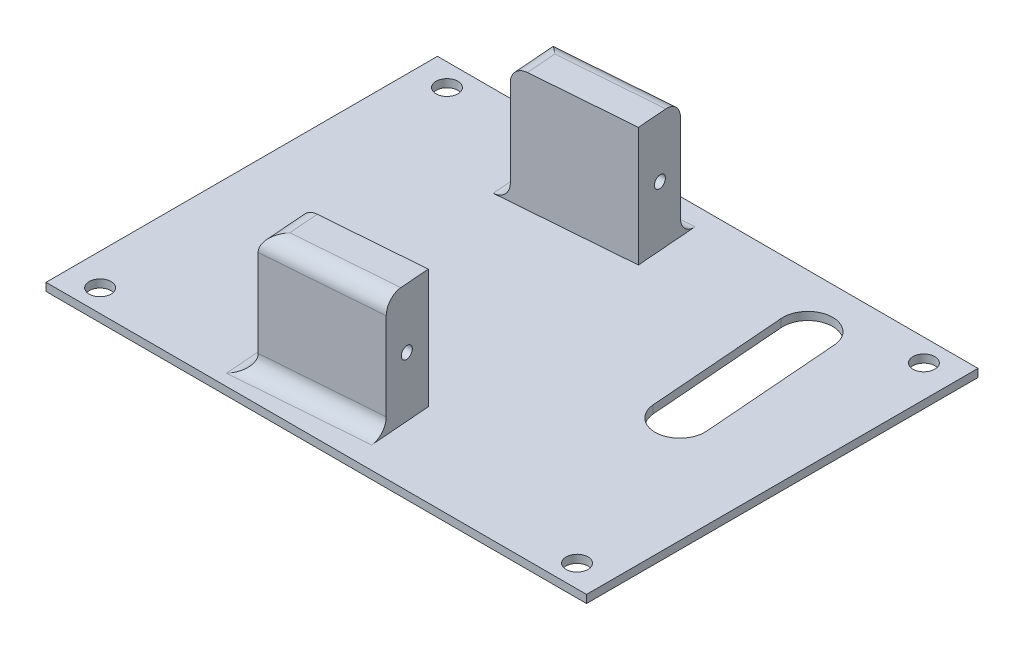
ISO-10303-21;
HEADER;
FILE_DESCRIPTION(('STEP AP214'),'2;1');
FILE_NAME('part.step','',(''),(''),'','','');
FILE_SCHEMA(('AUTOMOTIVE_DESIGN { 1 0 10303 214 1 1 1 1 }'));
ENDSEC;
DATA;
#1=APPLICATION_CONTEXT('core data for automotive mechanical design processes');
#2=APPLICATION_PROTOCOL_DEFINITION('international standard','automotive_design',2000,#1);
#3=PRODUCT_CONTEXT('',#1,'mechanical');
#4=PRODUCT('Part','Part','',(#3));
#5=PRODUCT_RELATED_PRODUCT_CATEGORY('part','',(#4));
#6=PRODUCT_DEFINITION_FORMATION('','',#4);
#7=PRODUCT_DEFINITION_CONTEXT('part definition',#1,'design');
#8=PRODUCT_DEFINITION('design','',#6,#7);
#9=PRODUCT_DEFINITION_SHAPE('','',#8);
#10=(LENGTH_UNIT() NAMED_UNIT(*) SI_UNIT(.MILLI.,.METRE.));
#11=(NAMED_UNIT(*) PLANE_ANGLE_UNIT() SI_UNIT($,.RADIAN.));
#12=(NAMED_UNIT(*) SI_UNIT($,.STERADIAN.) SOLID_ANGLE_UNIT());
#13=UNCERTAINTY_MEASURE_WITH_UNIT(LENGTH_MEASURE(1.E-05),#10,'distance_accuracy_value','');
#14=(GEOMETRIC_REPRESENTATION_CONTEXT(3) GLOBAL_UNCERTAINTY_ASSIGNED_CONTEXT((#13)) GLOBAL_UNIT_ASSIGNED_CONTEXT((#10,
#11,#12)) REPRESENTATION_CONTEXT('',''));
#15=CARTESIAN_POINT('',(0.,0.,0.));
#16=DIRECTION('',(0.,0.,1.));
#17=DIRECTION('',(1.,0.,0.));
#18=AXIS2_PLACEMENT_3D('',#15,#16,#17);
#19=CARTESIAN_POINT('',(0.,0.8,0.));
#20=DIRECTION('',(1.,0.,0.));
#21=DIRECTION('',(0.,0.,1.));
#22=AXIS2_PLACEMENT_3D('',#19,#20,#21);
#23=PLANE('',#22);
#24=DIRECTION('',(0.,0.,-1.));
#25=VECTOR('',#24,1.);
#26=CARTESIAN_POINT('',(0.,0.,0.));
#27=LINE('',#26,#25);
#28=CARTESIAN_POINT('',(0.,0.,39.4));
#29=VERTEX_POINT('',#28);
#30=CARTESIAN_POINT('',(0.,0.,0.));
#31=VERTEX_POINT('',#30);
#32=EDGE_CURVE('E308',#29,#31,#27,.T.);
#33=ORIENTED_EDGE('',*,*,#32,.F.);
#34=DIRECTION('',(0.,-1.,0.));
#35=VECTOR('',#34,1.);
#36=CARTESIAN_POINT('',(0.,0.8,39.4));
#37=LINE('',#36,#35);
#38=CARTESIAN_POINT('',(0.,0.8,39.4));
#39=VERTEX_POINT('',#38);
#40=EDGE_CURVE('E323',#39,#29,#37,.T.);
#41=ORIENTED_EDGE('',*,*,#40,.F.);
#42=DIRECTION('',(0.,0.,-1.));
#43=VECTOR('',#42,1.);
#44=CARTESIAN_POINT('',(0.,0.8,0.));
#45=LINE('',#44,#43);
#46=CARTESIAN_POINT('',(0.,0.8,0.));
#47=VERTEX_POINT('',#46);
#48=EDGE_CURVE('E311',#39,#47,#45,.T.);
#49=ORIENTED_EDGE('',*,*,#48,.T.);
#50=DIRECTION('',(0.,-1.,0.));
#51=VECTOR('',#50,1.);
#52=CARTESIAN_POINT('',(0.,0.8,0.));
#53=LINE('',#52,#51);
#54=EDGE_CURVE('E341',#47,#31,#53,.T.);
#55=ORIENTED_EDGE('',*,*,#54,.T.);
#56=EDGE_LOOP('',(#33,#41,#49,#55));
#57=FACE_BOUND('',#56,.T.);
#58=ADVANCED_FACE('F45',(#57),#23,.F.);
#59=CARTESIAN_POINT('',(0.,0.8,0.));
#60=DIRECTION('',(0.,0.,1.));
#61=DIRECTION('',(-1.,0.,0.));
#62=AXIS2_PLACEMENT_3D('',#59,#60,#61);
#63=PLANE('',#62);
#64=DIRECTION('',(1.,0.,0.));
#65=VECTOR('',#64,1.);
#66=CARTESIAN_POINT('',(0.,0.,0.));
#67=LINE('',#66,#65);
#68=CARTESIAN_POINT('',(54.4,0.,0.));
#69=VERTEX_POINT('',#68);
#70=EDGE_CURVE('E326',#31,#69,#67,.T.);
#71=ORIENTED_EDGE('',*,*,#70,.F.);
#72=ORIENTED_EDGE('',*,*,#54,.F.);
#73=DIRECTION('',(1.,0.,0.));
#74=VECTOR('',#73,1.);
#75=CARTESIAN_POINT('',(0.,0.8,0.));
#76=LINE('',#75,#74);
#77=CARTESIAN_POINT('',(54.4,0.8,0.));
#78=VERTEX_POINT('',#77);
#79=EDGE_CURVE('E314',#47,#78,#76,.T.);
#80=ORIENTED_EDGE('',*,*,#79,.T.);
#81=DIRECTION('',(0.,-1.,0.));
#82=VECTOR('',#81,1.);
#83=CARTESIAN_POINT('',(54.4,0.8,0.));
#84=LINE('',#83,#82);
#85=EDGE_CURVE('E338',#78,#69,#84,.T.);
#86=ORIENTED_EDGE('',*,*,#85,.T.);
#87=EDGE_LOOP('',(#71,#72,#80,#86));
#88=FACE_BOUND('',#87,.T.);
#89=ADVANCED_FACE('F465',(#88),#63,.F.);
#90=CARTESIAN_POINT('',(54.4,0.8,0.));
#91=DIRECTION('',(-1.,0.,0.));
#92=DIRECTION('',(0.,0.,-1.));
#93=AXIS2_PLACEMENT_3D('',#90,#91,#92);
#94=PLANE('',#93);
#95=DIRECTION('',(0.,0.,1.));
#96=VECTOR('',#95,1.);
#97=CARTESIAN_POINT('',(54.4,0.,0.));
#98=LINE('',#97,#96);
#99=CARTESIAN_POINT('',(54.4,0.,39.4));
#100=VERTEX_POINT('',#99);
#101=EDGE_CURVE('E329',#69,#100,#98,.T.);
#102=ORIENTED_EDGE('',*,*,#101,.F.);
#103=ORIENTED_EDGE('',*,*,#85,.F.);
#104=DIRECTION('',(0.,0.,1.));
#105=VECTOR('',#104,1.);
#106=CARTESIAN_POINT('',(54.4,0.8,0.));
#107=LINE('',#106,#105);
#108=CARTESIAN_POINT('',(54.4,0.8,39.4));
#109=VERTEX_POINT('',#108);
#110=EDGE_CURVE('E318',#78,#109,#107,.T.);
#111=ORIENTED_EDGE('',*,*,#110,.T.);
#112=DIRECTION('',(0.,-1.,0.));
#113=VECTOR('',#112,1.);
#114=CARTESIAN_POINT('',(54.4,0.8,39.4));
#115=LINE('',#114,#113);
#116=EDGE_CURVE('E335',#109,#100,#115,.T.);
#117=ORIENTED_EDGE('',*,*,#116,.T.);
#118=EDGE_LOOP('',(#102,#103,#111,#117));
#119=FACE_BOUND('',#118,.T.);
#120=ADVANCED_FACE('F463',(#119),#94,.F.);
#121=CARTESIAN_POINT('',(0.,0.8,39.4));
#122=DIRECTION('',(0.,0.,-1.));
#123=DIRECTION('',(1.,0.,0.));
#124=AXIS2_PLACEMENT_3D('',#121,#122,#123);
#125=PLANE('',#124);
#126=DIRECTION('',(-1.,0.,0.));
#127=VECTOR('',#126,1.);
#128=CARTESIAN_POINT('',(0.,0.,39.4));
#129=LINE('',#128,#127);
#130=EDGE_CURVE('E315',#100,#29,#129,.T.);
#131=ORIENTED_EDGE('',*,*,#130,.F.);
#132=ORIENTED_EDGE('',*,*,#116,.F.);
#133=DIRECTION('',(-1.,0.,0.));
#134=VECTOR('',#133,1.);
#135=CARTESIAN_POINT('',(0.,0.8,39.4));
#136=LINE('',#135,#134);
#137=EDGE_CURVE('E321',#109,#39,#136,.T.);
#138=ORIENTED_EDGE('',*,*,#137,.T.);
#139=ORIENTED_EDGE('',*,*,#40,.T.);
#140=EDGE_LOOP('',(#131,#132,#138,#139));
#141=FACE_BOUND('',#140,.T.);
#142=ADVANCED_FACE('F443',(#141),#125,.F.);
#143=CARTESIAN_POINT('',(0.,0.8,0.));
#144=DIRECTION('',(0.,-1.,0.));
#145=DIRECTION('',(0.,0.,1.));
#146=AXIS2_PLACEMENT_3D('',#143,#144,#145);
#147=PLANE('',#146);
#148=CARTESIAN_POINT('',(42.6363450689998,0.8,5.36196488668117));
#149=DIRECTION('',(0.,-1.,0.));
#150=DIRECTION('',(0.,0.,-1.));
#151=AXIS2_PLACEMENT_3D('',#148,#149,#150);
#152=CIRCLE('',#151,2.5);
#153=CARTESIAN_POINT('',(40.1438476958249,0.8,5.55550259545118));
#154=VERTEX_POINT('',#153);
#155=CARTESIAN_POINT('',(45.1288424421748,0.8,5.16842717791116));
#156=VERTEX_POINT('',#155);
#157=EDGE_CURVE('E203',#154,#156,#152,.T.);
#158=ORIENTED_EDGE('',*,*,#157,.T.);
#159=DIRECTION('',(-0.0774150835080043,0.,-0.996998949269982));
#160=VECTOR('',#159,1.);
#161=CARTESIAN_POINT('',(44.4594675366978,0.8,-3.45219360019891));
#162=LINE('',#161,#160);
#163=CARTESIAN_POINT('',(46.2126536112869,0.8,19.1264124676909));
#164=VERTEX_POINT('',#163);
#165=EDGE_CURVE('E226',#164,#156,#162,.T.);
#166=ORIENTED_EDGE('',*,*,#165,.F.);
#167=CARTESIAN_POINT('',(43.7201562381119,0.8,19.3199501764609));
#168=DIRECTION('',(0.,-1.,0.));
#169=DIRECTION('',(0.,0.,-1.));
#170=AXIS2_PLACEMENT_3D('',#167,#168,#169);
#171=CIRCLE('',#170,2.5);
#172=CARTESIAN_POINT('',(41.227658864937,0.8,19.5134878852309));
#173=VERTEX_POINT('',#172);
#174=EDGE_CURVE('E223',#164,#173,#171,.T.);
#175=ORIENTED_EDGE('',*,*,#174,.T.);
#176=DIRECTION('',(-0.0774150835080043,0.,-0.996998949269982));
#177=VECTOR('',#176,1.);
#178=CARTESIAN_POINT('',(39.4744727903479,0.8,-3.06511818265889));
#179=LINE('',#178,#177);
#180=EDGE_CURVE('E234',#173,#154,#179,.T.);
#181=ORIENTED_EDGE('',*,*,#180,.T.);
#182=EDGE_LOOP('',(#158,#166,#175,#181));
#183=FACE_BOUND('',#182,.T.);
#184=DIRECTION('',(0.996998949269982,0.,-0.0774150835080046));
#185=VECTOR('',#184,1.);
#186=CARTESIAN_POINT('',(3.05375947752351,0.8,39.3281884156255));
#187=LINE('',#186,#185);
#188=CARTESIAN_POINT('',(17.0050591665599,0.8,38.2448963707715));
#189=VERTEX_POINT('',#188);
#190=CARTESIAN_POINT('',(30.5642448766316,0.8,37.1920512350627));
#191=VERTEX_POINT('',#190);
#192=EDGE_CURVE('E394',#189,#191,#187,.T.);
#193=ORIENTED_EDGE('',*,*,#192,.F.);
#194=DIRECTION('',(-0.0774150835080041,0.,-0.996998949269982));
#195=VECTOR('',#194,1.);
#196=CARTESIAN_POINT('',(16.8811950329471,0.8,36.6496980519396));
#197=LINE('',#196,#195);
#198=CARTESIAN_POINT('',(16.5250856488103,0.8,32.0635028852977));
#199=VERTEX_POINT('',#198);
#200=EDGE_CURVE('E392',#199,#189,#197,.F.);
#201=ORIENTED_EDGE('',*,*,#200,.F.);
#202=DIRECTION('',(0.996998949269982,0.,-0.0774150835080049));
#203=VECTOR('',#202,1.);
#204=CARTESIAN_POINT('',(2.57378595977389,0.8,33.1467949301516));
#205=LINE('',#204,#203);
#206=CARTESIAN_POINT('',(30.084271358882,0.8,31.0106577495888));
#207=VERTEX_POINT('',#206);
#208=EDGE_CURVE('E241',#199,#207,#205,.T.);
#209=ORIENTED_EDGE('',*,*,#208,.T.);
#210=DIRECTION('',(-0.077415083508005,0.,-0.996998949269982));
#211=VECTOR('',#210,1.);
#212=CARTESIAN_POINT('',(27.5104853991081,0.8,-2.13613718056285));
#213=LINE('',#212,#211);
#214=EDGE_CURVE('E249',#191,#207,#213,.T.);
#215=ORIENTED_EDGE('',*,*,#214,.F.);
#216=EDGE_LOOP('',(#193,#201,#209,#215));
#217=FACE_BOUND('',#216,.T.);
#218=DIRECTION('',(-0.0774150835080049,0.,-0.996998949269982));
#219=VECTOR('',#218,1.);
#220=CARTESIAN_POINT('',(14.7445387281261,0.8,9.13252705208806));
#221=LINE('',#220,#219);
#222=CARTESIAN_POINT('',(14.2645652103765,0.8,2.95113356661417));
#223=VERTEX_POINT('',#222);
#224=CARTESIAN_POINT('',(14.7445387281261,0.8,9.13252705208806));
#225=VERTEX_POINT('',#224);
#226=EDGE_CURVE('E389',#223,#225,#221,.F.);
#227=ORIENTED_EDGE('',*,*,#226,.F.);
#228=DIRECTION('',(0.996998949269982,0.,-0.0774150835080045));
#229=VECTOR('',#228,1.);
#230=CARTESIAN_POINT('',(15.8597635292085,0.8,2.82726943300136));
#231=LINE('',#230,#229);
#232=CARTESIAN_POINT('',(27.8237509204483,0.8,1.89828843090531));
#233=VERTEX_POINT('',#232);
#234=EDGE_CURVE('E386',#233,#223,#231,.F.);
#235=ORIENTED_EDGE('',*,*,#234,.F.);
#236=DIRECTION('',(0.0774150835080042,0.,0.996998949269982));
#237=VECTOR('',#236,1.);
#238=CARTESIAN_POINT('',(27.5104853991081,0.8,-2.13613718056283));
#239=LINE('',#238,#237);
#240=CARTESIAN_POINT('',(28.3037244381979,0.8,8.0796819163792));
#241=VERTEX_POINT('',#240);
#242=EDGE_CURVE('E269',#233,#241,#239,.T.);
#243=ORIENTED_EDGE('',*,*,#242,.T.);
#244=DIRECTION('',(0.996998949269982,0.,-0.0774150835080043));
#245=VECTOR('',#244,1.);
#246=CARTESIAN_POINT('',(0.793239039089771,0.8,10.215819096942));
#247=LINE('',#246,#245);
#248=EDGE_CURVE('E264',#225,#241,#247,.T.);
#249=ORIENTED_EDGE('',*,*,#248,.F.);
#250=EDGE_LOOP('',(#227,#235,#243,#249));
#251=FACE_BOUND('',#250,.T.);
#252=CARTESIAN_POINT('',(3.2,0.8,37.155));
#253=DIRECTION('',(0.,-1.,0.));
#254=DIRECTION('',(0.,0.,-1.));
#255=AXIS2_PLACEMENT_3D('',#252,#253,#254);
#256=CIRCLE('',#255,1.1);
#257=CARTESIAN_POINT('',(3.2,0.8,36.055));
#258=VERTEX_POINT('',#257);
#259=EDGE_CURVE('E300',#258,#258,#256,.T.);
#260=ORIENTED_EDGE('',*,*,#259,.T.);
#261=EDGE_LOOP('',(#260));
#262=FACE_BOUND('',#261,.T.);
#263=CARTESIAN_POINT('',(51.2,0.8,2.24500000000001));
#264=DIRECTION('',(0.,-1.,0.));
#265=DIRECTION('',(0.,0.,-1.));
#266=AXIS2_PLACEMENT_3D('',#263,#264,#265);
#267=CIRCLE('',#266,1.1);
#268=CARTESIAN_POINT('',(51.2,0.8,1.14500000000001));
#269=VERTEX_POINT('',#268);
#270=EDGE_CURVE('E294',#269,#269,#267,.T.);
#271=ORIENTED_EDGE('',*,*,#270,.T.);
#272=EDGE_LOOP('',(#271));
#273=FACE_BOUND('',#272,.T.);
#274=CARTESIAN_POINT('',(3.2,0.8,2.245));
#275=DIRECTION('',(0.,-1.,0.));
#276=DIRECTION('',(0.,0.,-1.));
#277=AXIS2_PLACEMENT_3D('',#274,#275,#276);
#278=CIRCLE('',#277,1.1);
#279=CARTESIAN_POINT('',(3.2,0.8,1.145));
#280=VERTEX_POINT('',#279);
#281=EDGE_CURVE('E287',#280,#280,#278,.T.);
#282=ORIENTED_EDGE('',*,*,#281,.T.);
#283=EDGE_LOOP('',(#282));
#284=FACE_BOUND('',#283,.T.);
#285=CARTESIAN_POINT('',(51.2,0.8,37.155));
#286=DIRECTION('',(0.,-1.,0.));
#287=DIRECTION('',(0.,0.,-1.));
#288=AXIS2_PLACEMENT_3D('',#285,#286,#287);
#289=CIRCLE('',#288,1.1);
#290=CARTESIAN_POINT('',(51.2,0.8,36.055));
#291=VERTEX_POINT('',#290);
#292=EDGE_CURVE('E290',#291,#291,#289,.T.);
#293=ORIENTED_EDGE('',*,*,#292,.T.);
#294=EDGE_LOOP('',(#293));
#295=FACE_BOUND('',#294,.T.);
#296=ORIENTED_EDGE('',*,*,#48,.F.);
#297=ORIENTED_EDGE('',*,*,#137,.F.);
#298=ORIENTED_EDGE('',*,*,#110,.F.);
#299=ORIENTED_EDGE('',*,*,#79,.F.);
#300=EDGE_LOOP('',(#296,#297,#298,#299));
#301=FACE_BOUND('',#300,.T.);
#302=ADVANCED_FACE('F440',(#183,#217,#251,#262,#273,#284,#295,#301),#147,.F.);
#303=CARTESIAN_POINT('',(0.,0.,0.));
#304=DIRECTION('',(0.,-1.,0.));
#305=DIRECTION('',(0.,0.,1.));
#306=AXIS2_PLACEMENT_3D('',#303,#304,#305);
#307=PLANE('',#306);
#308=DIRECTION('',(-0.0774150835080043,0.,-0.996998949269982));
#309=VECTOR('',#308,1.);
#310=CARTESIAN_POINT('',(39.4744727903479,0.,-3.06511818265889));
#311=LINE('',#310,#309);
#312=CARTESIAN_POINT('',(41.227658864937,0.,19.5134878852309));
#313=VERTEX_POINT('',#312);
#314=CARTESIAN_POINT('',(40.1438476958249,0.,5.55550259545118));
#315=VERTEX_POINT('',#314);
#316=EDGE_CURVE('E216',#313,#315,#311,.T.);
#317=ORIENTED_EDGE('',*,*,#316,.F.);
#318=CARTESIAN_POINT('',(43.7201562381119,0.,19.3199501764609));
#319=DIRECTION('',(0.,-1.,0.));
#320=DIRECTION('',(0.,0.,-1.));
#321=AXIS2_PLACEMENT_3D('',#318,#319,#320);
#322=CIRCLE('',#321,2.5);
#323=CARTESIAN_POINT('',(46.2126536112869,0.,19.1264124676909));
#324=VERTEX_POINT('',#323);
#325=EDGE_CURVE('E209',#324,#313,#322,.T.);
#326=ORIENTED_EDGE('',*,*,#325,.F.);
#327=DIRECTION('',(-0.0774150835080043,0.,-0.996998949269982));
#328=VECTOR('',#327,1.);
#329=CARTESIAN_POINT('',(44.4594675366978,0.,-3.45219360019891));
#330=LINE('',#329,#328);
#331=CARTESIAN_POINT('',(45.1288424421748,0.,5.16842717791116));
#332=VERTEX_POINT('',#331);
#333=EDGE_CURVE('E218',#324,#332,#330,.T.);
#334=ORIENTED_EDGE('',*,*,#333,.T.);
#335=CARTESIAN_POINT('',(42.6363450689998,0.,5.36196488668117));
#336=DIRECTION('',(0.,-1.,0.));
#337=DIRECTION('',(0.,0.,-1.));
#338=AXIS2_PLACEMENT_3D('',#335,#336,#337);
#339=CIRCLE('',#338,2.5);
#340=EDGE_CURVE('E200',#315,#332,#339,.T.);
#341=ORIENTED_EDGE('',*,*,#340,.F.);
#342=EDGE_LOOP('',(#317,#326,#334,#341));
#343=FACE_BOUND('',#342,.T.);
#344=CARTESIAN_POINT('',(3.2,0.,37.155));
#345=DIRECTION('',(0.,-1.,0.));
#346=DIRECTION('',(0.,0.,-1.));
#347=AXIS2_PLACEMENT_3D('',#344,#345,#346);
#348=CIRCLE('',#347,1.1);
#349=CARTESIAN_POINT('',(3.2,0.,36.055));
#350=VERTEX_POINT('',#349);
#351=EDGE_CURVE('E286',#350,#350,#348,.T.);
#352=ORIENTED_EDGE('',*,*,#351,.F.);
#353=EDGE_LOOP('',(#352));
#354=FACE_BOUND('',#353,.T.);
#355=CARTESIAN_POINT('',(51.2,0.,2.24500000000001));
#356=DIRECTION('',(0.,-1.,0.));
#357=DIRECTION('',(0.,0.,-1.));
#358=AXIS2_PLACEMENT_3D('',#355,#356,#357);
#359=CIRCLE('',#358,1.1);
#360=CARTESIAN_POINT('',(51.2,0.,1.14500000000001));
#361=VERTEX_POINT('',#360);
#362=EDGE_CURVE('E297',#361,#361,#359,.T.);
#363=ORIENTED_EDGE('',*,*,#362,.F.);
#364=EDGE_LOOP('',(#363));
#365=FACE_BOUND('',#364,.T.);
#366=CARTESIAN_POINT('',(3.2,0.,2.245));
#367=DIRECTION('',(0.,-1.,0.));
#368=DIRECTION('',(0.,0.,-1.));
#369=AXIS2_PLACEMENT_3D('',#366,#367,#368);
#370=CIRCLE('',#369,1.1);
#371=CARTESIAN_POINT('',(3.2,0.,1.145));
#372=VERTEX_POINT('',#371);
#373=EDGE_CURVE('E291',#372,#372,#370,.T.);
#374=ORIENTED_EDGE('',*,*,#373,.F.);
#375=EDGE_LOOP('',(#374));
#376=FACE_BOUND('',#375,.T.);
#377=CARTESIAN_POINT('',(51.2,0.,37.155));
#378=DIRECTION('',(0.,-1.,0.));
#379=DIRECTION('',(0.,0.,-1.));
#380=AXIS2_PLACEMENT_3D('',#377,#378,#379);
#381=CIRCLE('',#380,1.1);
#382=CARTESIAN_POINT('',(51.2,0.,36.055));
#383=VERTEX_POINT('',#382);
#384=EDGE_CURVE('E305',#383,#383,#381,.T.);
#385=ORIENTED_EDGE('',*,*,#384,.F.);
#386=EDGE_LOOP('',(#385));
#387=FACE_BOUND('',#386,.T.);
#388=ORIENTED_EDGE('',*,*,#32,.T.);
#389=ORIENTED_EDGE('',*,*,#70,.T.);
#390=ORIENTED_EDGE('',*,*,#101,.T.);
#391=ORIENTED_EDGE('',*,*,#130,.T.);
#392=EDGE_LOOP('',(#388,#389,#390,#391));
#393=FACE_BOUND('',#392,.T.);
#394=ADVANCED_FACE('F213',(#343,#354,#365,#376,#387,#393),#307,.T.);
#395=CARTESIAN_POINT('',(51.2,0.,37.155));
#396=DIRECTION('',(0.,1.,0.));
#397=DIRECTION('',(0.,0.,-1.));
#398=AXIS2_PLACEMENT_3D('',#395,#396,#397);
#399=CYLINDRICAL_SURFACE('',#398,1.1);
#400=ORIENTED_EDGE('',*,*,#384,.T.);
#401=EDGE_LOOP('',(#400));
#402=FACE_BOUND('',#401,.T.);
#403=ORIENTED_EDGE('',*,*,#292,.F.);
#404=EDGE_LOOP('',(#403));
#405=FACE_BOUND('',#404,.T.);
#406=ADVANCED_FACE('F468',(#402,#405),#399,.F.);
#407=CARTESIAN_POINT('',(3.2,0.,2.245));
#408=DIRECTION('',(0.,1.,0.));
#409=DIRECTION('',(0.,0.,-1.));
#410=AXIS2_PLACEMENT_3D('',#407,#408,#409);
#411=CYLINDRICAL_SURFACE('',#410,1.1);
#412=ORIENTED_EDGE('',*,*,#373,.T.);
#413=EDGE_LOOP('',(#412));
#414=FACE_BOUND('',#413,.T.);
#415=ORIENTED_EDGE('',*,*,#281,.F.);
#416=EDGE_LOOP('',(#415));
#417=FACE_BOUND('',#416,.T.);
#418=ADVANCED_FACE('F473',(#414,#417),#411,.F.);
#419=CARTESIAN_POINT('',(51.2,0.,2.24500000000001));
#420=DIRECTION('',(0.,1.,0.));
#421=DIRECTION('',(0.,0.,-1.));
#422=AXIS2_PLACEMENT_3D('',#419,#420,#421);
#423=CYLINDRICAL_SURFACE('',#422,1.1);
#424=ORIENTED_EDGE('',*,*,#362,.T.);
#425=EDGE_LOOP('',(#424));
#426=FACE_BOUND('',#425,.T.);
#427=ORIENTED_EDGE('',*,*,#270,.F.);
#428=EDGE_LOOP('',(#427));
#429=FACE_BOUND('',#428,.T.);
#430=ADVANCED_FACE('F670',(#426,#429),#423,.F.);
#431=CARTESIAN_POINT('',(3.2,0.,37.155));
#432=DIRECTION('',(0.,1.,0.));
#433=DIRECTION('',(0.,0.,-1.));
#434=AXIS2_PLACEMENT_3D('',#431,#432,#433);
#435=CYLINDRICAL_SURFACE('',#434,1.1);
#436=ORIENTED_EDGE('',*,*,#351,.T.);
#437=EDGE_LOOP('',(#436));
#438=FACE_BOUND('',#437,.T.);
#439=ORIENTED_EDGE('',*,*,#259,.F.);
#440=EDGE_LOOP('',(#439));
#441=FACE_BOUND('',#440,.T.);
#442=ADVANCED_FACE('F663',(#438,#441),#435,.F.);
#443=CARTESIAN_POINT('',(0.793239039089771,12.8,10.215819096942));
#444=DIRECTION('',(0.0774150835080043,0.,0.996998949269982));
#445=DIRECTION('',(-0.996998949269982,0.,0.0774150835080043));
#446=AXIS2_PLACEMENT_3D('',#443,#444,#445);
#447=PLANE('',#446);
#448=DIRECTION('',(0.,-1.,0.));
#449=VECTOR('',#448,1.);
#450=CARTESIAN_POINT('',(16.3397370469581,12.8,9.00866291847525));
#451=LINE('',#450,#449);
#452=CARTESIAN_POINT('',(16.3397370469581,11.2,9.00866291847525));
#453=VERTEX_POINT('',#452);
#454=CARTESIAN_POINT('',(16.3397370469581,2.4,9.00866291847525));
#455=VERTEX_POINT('',#454);
#456=EDGE_CURVE('E283',#453,#455,#451,.T.);
#457=ORIENTED_EDGE('',*,*,#456,.T.);
#458=CARTESIAN_POINT('',(14.7445387281261,2.4,9.13252705208806));
#459=DIRECTION('',(-0.0774150835080043,0.,-0.996998949269982));
#460=DIRECTION('',(-0.996998949269982,0.,0.0774150835080043));
#461=AXIS2_PLACEMENT_3D('',#458,#459,#460);
#462=CIRCLE('',#461,1.6);
#463=EDGE_CURVE('E54',#225,#455,#462,.F.);
#464=ORIENTED_EDGE('',*,*,#463,.F.);
#465=ORIENTED_EDGE('',*,*,#248,.T.);
#466=DIRECTION('',(0.,-1.,0.));
#467=VECTOR('',#466,1.);
#468=CARTESIAN_POINT('',(28.3037244381979,12.8,8.0796819163792));
#469=LINE('',#468,#467);
#470=CARTESIAN_POINT('',(28.3037244381979,12.8,8.0796819163792));
#471=VERTEX_POINT('',#470);
#472=EDGE_CURVE('E271',#471,#241,#469,.T.);
#473=ORIENTED_EDGE('',*,*,#472,.F.);
#474=DIRECTION('',(0.996998949269982,0.,-0.0774150835080043));
#475=VECTOR('',#474,1.);
#476=CARTESIAN_POINT('',(0.793239039089771,12.8,10.215819096942));
#477=LINE('',#476,#475);
#478=CARTESIAN_POINT('',(17.9349353657901,12.8,8.88479878486245));
#479=VERTEX_POINT('',#478);
#480=EDGE_CURVE('E265',#479,#471,#477,.T.);
#481=ORIENTED_EDGE('',*,*,#480,.F.);
#482=CARTESIAN_POINT('',(17.9349353657901,11.2,8.88479878486245));
#483=DIRECTION('',(-0.0774150835080043,0.,-0.996998949269982));
#484=DIRECTION('',(-0.996998949269982,0.,0.0774150835080043));
#485=AXIS2_PLACEMENT_3D('',#482,#483,#484);
#486=CIRCLE('',#485,1.6);
#487=EDGE_CURVE('E354',#453,#479,#486,.T.);
#488=ORIENTED_EDGE('',*,*,#487,.F.);
#489=EDGE_LOOP('',(#457,#464,#465,#473,#481,#488));
#490=FACE_BOUND('',#489,.T.);
#491=ADVANCED_FACE('F426',(#490),#447,.T.);
#492=CARTESIAN_POINT('',(15.5464980078683,12.8,-1.20715617846679));
#493=DIRECTION('',(0.996998949269982,0.,-0.0774150835080049));
#494=DIRECTION('',(0.0774150835080049,0.,0.996998949269982));
#495=AXIS2_PLACEMENT_3D('',#492,#493,#494);
#496=PLANE('',#495);
#497=DIRECTION('',(0.,-1.,0.));
#498=VECTOR('',#497,1.);
#499=CARTESIAN_POINT('',(15.9836276628213,12.8,4.42246775183333));
#500=LINE('',#499,#498);
#501=CARTESIAN_POINT('',(15.9836276628213,11.2,4.42246775183333));
#502=VERTEX_POINT('',#501);
#503=CARTESIAN_POINT('',(15.9836276628213,2.4,4.42246775183333));
#504=VERTEX_POINT('',#503);
#505=EDGE_CURVE('E280',#502,#504,#500,.T.);
#506=ORIENTED_EDGE('',*,*,#505,.T.);
#507=DIRECTION('',(-0.0774150835080049,0.,-0.996998949269982));
#508=VECTOR('',#507,1.);
#509=CARTESIAN_POINT('',(15.9836276628213,2.4,4.42246775183333));
#510=LINE('',#509,#508);
#511=EDGE_CURVE('E349',#455,#504,#510,.T.);
#512=ORIENTED_EDGE('',*,*,#511,.F.);
#513=ORIENTED_EDGE('',*,*,#456,.F.);
#514=DIRECTION('',(-0.0774150835080049,0.,-0.996998949269982));
#515=VECTOR('',#514,1.);
#516=CARTESIAN_POINT('',(16.3397370469581,11.2,9.00866291847525));
#517=LINE('',#516,#515);
#518=EDGE_CURVE('E352',#502,#453,#517,.F.);
#519=ORIENTED_EDGE('',*,*,#518,.F.);
#520=EDGE_LOOP('',(#506,#512,#513,#519));
#521=FACE_BOUND('',#520,.T.);
#522=ADVANCED_FACE('F420',(#521),#496,.F.);
#523=CARTESIAN_POINT('',(0.437129654952953,12.8,5.62962393030012));
#524=DIRECTION('',(0.0774150835080045,0.,0.996998949269982));
#525=DIRECTION('',(-0.996998949269982,0.,0.0774150835080045));
#526=AXIS2_PLACEMENT_3D('',#523,#524,#525);
#527=PLANE('',#526);
#528=DIRECTION('',(0.,-1.,0.));
#529=VECTOR('',#528,1.);
#530=CARTESIAN_POINT('',(27.9476150540611,12.8,3.49348674973728));
#531=LINE('',#530,#529);
#532=CARTESIAN_POINT('',(27.9476150540611,11.2,3.49348674973728));
#533=VERTEX_POINT('',#532);
#534=CARTESIAN_POINT('',(27.9476150540611,2.4,3.49348674973728));
#535=VERTEX_POINT('',#534);
#536=EDGE_CURVE('E277',#533,#535,#531,.T.);
#537=ORIENTED_EDGE('',*,*,#536,.T.);
#538=DIRECTION('',(0.996998949269982,0.,-0.0774150835080045));
#539=VECTOR('',#538,1.);
#540=CARTESIAN_POINT('',(27.9476150540611,2.4,3.49348674973728));
#541=LINE('',#540,#539);
#542=EDGE_CURVE('E359',#504,#535,#541,.T.);
#543=ORIENTED_EDGE('',*,*,#542,.F.);
#544=ORIENTED_EDGE('',*,*,#505,.F.);
#545=DIRECTION('',(0.996998949269982,0.,-0.0774150835080045));
#546=VECTOR('',#545,1.);
#547=CARTESIAN_POINT('',(15.9836276628213,11.2,4.42246775183333));
#548=LINE('',#547,#546);
#549=EDGE_CURVE('E362',#533,#502,#548,.F.);
#550=ORIENTED_EDGE('',*,*,#549,.F.);
#551=EDGE_LOOP('',(#537,#543,#544,#550));
#552=FACE_BOUND('',#551,.T.);
#553=ADVANCED_FACE('F413',(#552),#527,.F.);
#554=CARTESIAN_POINT('',(27.5104853991081,12.8,-2.13613718056283));
#555=DIRECTION('',(-0.996998949269982,0.,0.0774150835080042));
#556=DIRECTION('',(-0.0774150835080042,0.,-0.996998949269982));
#557=AXIS2_PLACEMENT_3D('',#554,#555,#556);
#558=PLANE('',#557);
#559=CARTESIAN_POINT('',(28.1217989919541,6.8,5.73673438559474));
#560=DIRECTION('',(-0.996998949269982,0.,0.0774150835080042));
#561=DIRECTION('',(0.0774150835080042,0.,0.996998949269982));
#562=AXIS2_PLACEMENT_3D('',#559,#560,#561);
#563=CIRCLE('',#562,0.6);
#564=CARTESIAN_POINT('',(28.1682480420589,6.8,6.33493375515673));
#565=VERTEX_POINT('',#564);
#566=EDGE_CURVE('E873',#565,#565,#563,.T.);
#567=ORIENTED_EDGE('',*,*,#566,.T.);
#568=EDGE_LOOP('',(#567));
#569=FACE_BOUND('',#568,.T.);
#570=DIRECTION('',(0.0774150835080042,0.,0.996998949269982));
#571=VECTOR('',#570,1.);
#572=CARTESIAN_POINT('',(27.5104853991081,12.8,-2.13613718056283));
#573=LINE('',#572,#571);
#574=CARTESIAN_POINT('',(28.0714791876739,12.8,5.08868506856925));
#575=VERTEX_POINT('',#574);
#576=EDGE_CURVE('E268',#575,#471,#573,.T.);
#577=ORIENTED_EDGE('',*,*,#576,.T.);
#578=ORIENTED_EDGE('',*,*,#472,.T.);
#579=ORIENTED_EDGE('',*,*,#242,.F.);
#580=CARTESIAN_POINT('',(27.8237509204483,2.4,1.89828843090531));
#581=DIRECTION('',(0.996998949269982,0.,-0.0774150835080042));
#582=DIRECTION('',(-0.0774150835080042,0.,-0.996998949269982));
#583=AXIS2_PLACEMENT_3D('',#580,#581,#582);
#584=CIRCLE('',#583,1.6);
#585=EDGE_CURVE('E11',#535,#233,#584,.T.);
#586=ORIENTED_EDGE('',*,*,#585,.F.);
#587=ORIENTED_EDGE('',*,*,#536,.F.);
#588=CARTESIAN_POINT('',(28.0714791876739,11.2,5.08868506856925));
#589=DIRECTION('',(0.996998949269982,0.,-0.0774150835080042));
#590=DIRECTION('',(-0.0774150835080042,0.,-0.996998949269982));
#591=AXIS2_PLACEMENT_3D('',#588,#589,#590);
#592=CIRCLE('',#591,1.6);
#593=EDGE_CURVE('E357',#575,#533,#592,.F.);
#594=ORIENTED_EDGE('',*,*,#593,.F.);
#595=EDGE_LOOP('',(#577,#578,#579,#586,#587,#594));
#596=FACE_BOUND('',#595,.T.);
#597=ADVANCED_FACE('F436',(#569,#596),#558,.F.);
#598=CARTESIAN_POINT('',(0.,12.8,0.));
#599=DIRECTION('',(0.,1.,0.));
#600=DIRECTION('',(0.,0.,-1.));
#601=AXIS2_PLACEMENT_3D('',#598,#599,#600);
#602=PLANE('',#601);
#603=ORIENTED_EDGE('',*,*,#480,.T.);
#604=ORIENTED_EDGE('',*,*,#576,.F.);
#605=DIRECTION('',(0.996998949269982,0.,-0.0774150835080045));
#606=VECTOR('',#605,1.);
#607=CARTESIAN_POINT('',(28.0714791876739,12.8,5.08868506856925));
#608=LINE('',#607,#606);
#609=CARTESIAN_POINT('',(17.7026901152661,12.8,5.89380193705249));
#610=VERTEX_POINT('',#609);
#611=EDGE_CURVE('E344',#610,#575,#608,.T.);
#612=ORIENTED_EDGE('',*,*,#611,.F.);
#613=DIRECTION('',(-0.0774150835080049,0.,-0.996998949269982));
#614=VECTOR('',#613,1.);
#615=CARTESIAN_POINT('',(17.5788259816533,12.8,4.29860361822052));
#616=LINE('',#615,#614);
#617=EDGE_CURVE('E346',#479,#610,#616,.T.);
#618=ORIENTED_EDGE('',*,*,#617,.F.);
#619=EDGE_LOOP('',(#603,#604,#612,#618));
#620=FACE_BOUND('',#619,.T.);
#621=ADVANCED_FACE('F430',(#620),#602,.T.);
#622=CARTESIAN_POINT('',(2.9298953439107,12.8,37.7329900967936));
#623=DIRECTION('',(0.0774150835080046,0.,0.996998949269982));
#624=DIRECTION('',(-0.996998949269982,0.,0.0774150835080046));
#625=AXIS2_PLACEMENT_3D('',#622,#623,#624);
#626=PLANE('',#625);
#627=DIRECTION('',(0.,-1.,0.));
#628=VECTOR('',#627,1.);
#629=CARTESIAN_POINT('',(18.476393351779,12.8,36.5258339183268));
#630=LINE('',#629,#628);
#631=CARTESIAN_POINT('',(18.476393351779,11.2,36.5258339183268));
#632=VERTEX_POINT('',#631);
#633=CARTESIAN_POINT('',(18.476393351779,2.4,36.5258339183268));
#634=VERTEX_POINT('',#633);
#635=EDGE_CURVE('E261',#632,#634,#630,.T.);
#636=ORIENTED_EDGE('',*,*,#635,.T.);
#637=DIRECTION('',(0.996998949269982,0.,-0.0774150835080046));
#638=VECTOR('',#637,1.);
#639=CARTESIAN_POINT('',(2.9298953439107,2.4,37.7329900967936));
#640=LINE('',#639,#638);
#641=CARTESIAN_POINT('',(30.4403807430188,2.4,35.5968529162307));
#642=VERTEX_POINT('',#641);
#643=EDGE_CURVE('E365',#642,#634,#640,.F.);
#644=ORIENTED_EDGE('',*,*,#643,.F.);
#645=DIRECTION('',(0.,-1.,0.));
#646=VECTOR('',#645,1.);
#647=CARTESIAN_POINT('',(30.4403807430188,12.8,35.5968529162307));
#648=LINE('',#647,#646);
#649=CARTESIAN_POINT('',(30.4403807430188,11.2,35.5968529162307));
#650=VERTEX_POINT('',#649);
#651=EDGE_CURVE('E251',#650,#642,#648,.T.);
#652=ORIENTED_EDGE('',*,*,#651,.F.);
#653=DIRECTION('',(0.996998949269982,0.,-0.0774150835080046));
#654=VECTOR('',#653,1.);
#655=CARTESIAN_POINT('',(2.9298953439107,11.2,37.7329900967936));
#656=LINE('',#655,#654);
#657=EDGE_CURVE('E367',#632,#650,#656,.T.);
#658=ORIENTED_EDGE('',*,*,#657,.F.);
#659=EDGE_LOOP('',(#636,#644,#652,#658));
#660=FACE_BOUND('',#659,.T.);
#661=ADVANCED_FACE('F623',(#660),#626,.T.);
#662=CARTESIAN_POINT('',(15.5464980078684,12.8,-1.20715617846678));
#663=DIRECTION('',(0.996998949269982,0.,-0.0774150835080041));
#664=DIRECTION('',(0.0774150835080041,0.,0.996998949269982));
#665=AXIS2_PLACEMENT_3D('',#662,#663,#664);
#666=PLANE('',#665);
#667=DIRECTION('',(0.,-1.,0.));
#668=VECTOR('',#667,1.);
#669=CARTESIAN_POINT('',(18.1202839676422,12.8,31.9396387516848));
#670=LINE('',#669,#668);
#671=CARTESIAN_POINT('',(18.1202839676422,11.2,31.9396387516848));
#672=VERTEX_POINT('',#671);
#673=CARTESIAN_POINT('',(18.1202839676422,2.4,31.9396387516848));
#674=VERTEX_POINT('',#673);
#675=EDGE_CURVE('E258',#672,#674,#670,.T.);
#676=ORIENTED_EDGE('',*,*,#675,.T.);
#677=DIRECTION('',(-0.0774150835080041,0.,-0.996998949269982));
#678=VECTOR('',#677,1.);
#679=CARTESIAN_POINT('',(18.1202839676422,2.4,31.9396387516849));
#680=LINE('',#679,#678);
#681=EDGE_CURVE('E380',#634,#674,#680,.T.);
#682=ORIENTED_EDGE('',*,*,#681,.F.);
#683=ORIENTED_EDGE('',*,*,#635,.F.);
#684=DIRECTION('',(-0.0774150835080041,0.,-0.996998949269982));
#685=VECTOR('',#684,1.);
#686=CARTESIAN_POINT('',(18.4763933517791,11.2,36.5258339183268));
#687=LINE('',#686,#685);
#688=EDGE_CURVE('E383',#672,#632,#687,.F.);
#689=ORIENTED_EDGE('',*,*,#688,.F.);
#690=EDGE_LOOP('',(#676,#682,#683,#689));
#691=FACE_BOUND('',#690,.T.);
#692=ADVANCED_FACE('F615',(#691),#666,.F.);
#693=CARTESIAN_POINT('',(2.57378595977389,12.8,33.1467949301516));
#694=DIRECTION('',(0.0774150835080049,0.,0.996998949269982));
#695=DIRECTION('',(-0.996998949269982,0.,0.0774150835080049));
#696=AXIS2_PLACEMENT_3D('',#693,#694,#695);
#697=PLANE('',#696);
#698=DIRECTION('',(0.996998949269982,0.,-0.0774150835080049));
#699=VECTOR('',#698,1.);
#700=CARTESIAN_POINT('',(2.57378595977389,12.8,33.1467949301516));
#701=LINE('',#700,#699);
#702=CARTESIAN_POINT('',(19.7154822864742,12.8,31.815774618072));
#703=VERTEX_POINT('',#702);
#704=CARTESIAN_POINT('',(30.084271358882,12.8,31.0106577495888));
#705=VERTEX_POINT('',#704);
#706=EDGE_CURVE('E245',#703,#705,#701,.T.);
#707=ORIENTED_EDGE('',*,*,#706,.T.);
#708=DIRECTION('',(0.,-1.,0.));
#709=VECTOR('',#708,1.);
#710=CARTESIAN_POINT('',(30.084271358882,12.8,31.0106577495888));
#711=LINE('',#710,#709);
#712=EDGE_CURVE('E256',#705,#207,#711,.T.);
#713=ORIENTED_EDGE('',*,*,#712,.T.);
#714=ORIENTED_EDGE('',*,*,#208,.F.);
#715=CARTESIAN_POINT('',(16.5250856488103,2.4,32.0635028852977));
#716=DIRECTION('',(-0.0774150835080049,0.,-0.996998949269982));
#717=DIRECTION('',(-0.996998949269982,0.,0.0774150835080049));
#718=AXIS2_PLACEMENT_3D('',#715,#716,#717);
#719=CIRCLE('',#718,1.6);
#720=EDGE_CURVE('E397',#674,#199,#719,.T.);
#721=ORIENTED_EDGE('',*,*,#720,.F.);
#722=ORIENTED_EDGE('',*,*,#675,.F.);
#723=CARTESIAN_POINT('',(19.7154822864742,11.2,31.815774618072));
#724=DIRECTION('',(-0.0774150835080049,0.,-0.996998949269982));
#725=DIRECTION('',(-0.996998949269982,0.,0.0774150835080049));
#726=AXIS2_PLACEMENT_3D('',#723,#724,#725);
#727=CIRCLE('',#726,1.6);
#728=EDGE_CURVE('E378',#703,#672,#727,.F.);
#729=ORIENTED_EDGE('',*,*,#728,.F.);
#730=EDGE_LOOP('',(#707,#713,#714,#721,#722,#729));
#731=FACE_BOUND('',#730,.T.);
#732=ADVANCED_FACE('F607',(#731),#697,.F.);
#733=CARTESIAN_POINT('',(27.5104853991081,12.8,-2.13613718056285));
#734=DIRECTION('',(0.996998949269982,0.,-0.077415083508005));
#735=DIRECTION('',(0.077415083508005,0.,0.996998949269982));
#736=AXIS2_PLACEMENT_3D('',#733,#734,#735);
#737=PLANE('',#736);
#738=CARTESIAN_POINT('',(30.2661968051258,6.8,33.3536052803732));
#739=DIRECTION('',(-0.996998949269982,0.,0.0774150835080042));
#740=DIRECTION('',(-0.0774150835080042,0.,-0.996998949269982));
#741=AXIS2_PLACEMENT_3D('',#738,#739,#740);
#742=CIRCLE('',#741,0.600000000000001);
#743=CARTESIAN_POINT('',(30.219747755021,6.8,32.7554059108113));
#744=VERTEX_POINT('',#743);
#745=EDGE_CURVE('E875',#744,#744,#742,.T.);
#746=ORIENTED_EDGE('',*,*,#745,.T.);
#747=EDGE_LOOP('',(#746));
#748=FACE_BOUND('',#747,.T.);
#749=ORIENTED_EDGE('',*,*,#651,.T.);
#750=CARTESIAN_POINT('',(30.5642448766316,2.4,37.1920512350627));
#751=DIRECTION('',(-0.996998949269982,0.,0.077415083508005));
#752=DIRECTION('',(0.077415083508005,0.,0.996998949269982));
#753=AXIS2_PLACEMENT_3D('',#750,#751,#752);
#754=CIRCLE('',#753,1.6);
#755=EDGE_CURVE('E62',#191,#642,#754,.F.);
#756=ORIENTED_EDGE('',*,*,#755,.F.);
#757=ORIENTED_EDGE('',*,*,#214,.T.);
#758=ORIENTED_EDGE('',*,*,#712,.F.);
#759=DIRECTION('',(-0.077415083508005,0.,-0.996998949269982));
#760=VECTOR('',#759,1.);
#761=CARTESIAN_POINT('',(27.5104853991081,12.8,-2.13613718056285));
#762=LINE('',#761,#760);
#763=CARTESIAN_POINT('',(30.316516609406,12.8,34.0016545973987));
#764=VERTEX_POINT('',#763);
#765=EDGE_CURVE('E248',#764,#705,#762,.T.);
#766=ORIENTED_EDGE('',*,*,#765,.F.);
#767=CARTESIAN_POINT('',(30.316516609406,11.2,34.0016545973987));
#768=DIRECTION('',(-0.996998949269982,0.,0.077415083508005));
#769=DIRECTION('',(0.077415083508005,0.,0.996998949269982));
#770=AXIS2_PLACEMENT_3D('',#767,#768,#769);
#771=CIRCLE('',#770,1.6);
#772=EDGE_CURVE('E370',#650,#764,#771,.T.);
#773=ORIENTED_EDGE('',*,*,#772,.F.);
#774=EDGE_LOOP('',(#749,#756,#757,#758,#766,#773));
#775=FACE_BOUND('',#774,.T.);
#776=ADVANCED_FACE('F599',(#748,#775),#737,.T.);
#777=CARTESIAN_POINT('',(0.,12.8,0.));
#778=DIRECTION('',(0.,1.,0.));
#779=DIRECTION('',(0.,0.,-1.));
#780=AXIS2_PLACEMENT_3D('',#777,#778,#779);
#781=PLANE('',#780);
#782=ORIENTED_EDGE('',*,*,#765,.T.);
#783=ORIENTED_EDGE('',*,*,#706,.F.);
#784=DIRECTION('',(-0.0774150835080041,0.,-0.996998949269982));
#785=VECTOR('',#784,1.);
#786=CARTESIAN_POINT('',(19.7154822864742,12.8,31.8157746180721));
#787=LINE('',#786,#785);
#788=CARTESIAN_POINT('',(19.9477275369982,12.8,34.806771465882));
#789=VERTEX_POINT('',#788);
#790=EDGE_CURVE('E373',#789,#703,#787,.T.);
#791=ORIENTED_EDGE('',*,*,#790,.F.);
#792=DIRECTION('',(0.996998949269982,0.,-0.0774150835080046));
#793=VECTOR('',#792,1.);
#794=CARTESIAN_POINT('',(2.80603121029789,12.8,36.1377917779616));
#795=LINE('',#794,#793);
#796=EDGE_CURVE('E375',#764,#789,#795,.F.);
#797=ORIENTED_EDGE('',*,*,#796,.F.);
#798=EDGE_LOOP('',(#782,#783,#791,#797));
#799=FACE_BOUND('',#798,.T.);
#800=ADVANCED_FACE('F592',(#799),#781,.T.);
#801=CARTESIAN_POINT('',(39.4744727903479,0.,-3.06511818265889));
#802=DIRECTION('',(-0.996998949269982,0.,0.0774150835080044));
#803=DIRECTION('',(-0.0774150835080044,0.,-0.996998949269982));
#804=AXIS2_PLACEMENT_3D('',#801,#802,#803);
#805=PLANE('',#804);
#806=ORIENTED_EDGE('',*,*,#180,.F.);
#807=DIRECTION('',(0.,1.,0.));
#808=VECTOR('',#807,1.);
#809=CARTESIAN_POINT('',(41.227658864937,0.,19.5134878852309));
#810=LINE('',#809,#808);
#811=EDGE_CURVE('E221',#313,#173,#810,.T.);
#812=ORIENTED_EDGE('',*,*,#811,.F.);
#813=ORIENTED_EDGE('',*,*,#316,.T.);
#814=DIRECTION('',(0.,1.,0.));
#815=VECTOR('',#814,1.);
#816=CARTESIAN_POINT('',(40.1438476958249,0.,5.55550259545118));
#817=LINE('',#816,#815);
#818=EDGE_CURVE('E197',#315,#154,#817,.T.);
#819=ORIENTED_EDGE('',*,*,#818,.T.);
#820=EDGE_LOOP('',(#806,#812,#813,#819));
#821=FACE_BOUND('',#820,.T.);
#822=ADVANCED_FACE('F220',(#821),#805,.F.);
#823=CARTESIAN_POINT('',(43.7201562381119,0.,19.3199501764609));
#824=DIRECTION('',(0.,1.,0.));
#825=DIRECTION('',(0.,0.,-1.));
#826=AXIS2_PLACEMENT_3D('',#823,#824,#825);
#827=CYLINDRICAL_SURFACE('',#826,2.5);
#828=ORIENTED_EDGE('',*,*,#174,.F.);
#829=DIRECTION('',(0.,1.,0.));
#830=VECTOR('',#829,1.);
#831=CARTESIAN_POINT('',(46.2126536112869,0.,19.1264124676909));
#832=LINE('',#831,#830);
#833=EDGE_CURVE('E242',#324,#164,#832,.T.);
#834=ORIENTED_EDGE('',*,*,#833,.F.);
#835=ORIENTED_EDGE('',*,*,#325,.T.);
#836=ORIENTED_EDGE('',*,*,#811,.T.);
#837=EDGE_LOOP('',(#828,#834,#835,#836));
#838=FACE_BOUND('',#837,.T.);
#839=ADVANCED_FACE('F577',(#838),#827,.F.);
#840=CARTESIAN_POINT('',(44.4594675366978,0.,-3.45219360019891));
#841=DIRECTION('',(-0.996998949269982,0.,0.0774150835080044));
#842=DIRECTION('',(-0.0774150835080044,0.,-0.996998949269982));
#843=AXIS2_PLACEMENT_3D('',#840,#841,#842);
#844=PLANE('',#843);
#845=ORIENTED_EDGE('',*,*,#165,.T.);
#846=DIRECTION('',(0.,1.,0.));
#847=VECTOR('',#846,1.);
#848=CARTESIAN_POINT('',(45.1288424421748,0.,5.16842717791116));
#849=LINE('',#848,#847);
#850=EDGE_CURVE('E208',#332,#156,#849,.T.);
#851=ORIENTED_EDGE('',*,*,#850,.F.);
#852=ORIENTED_EDGE('',*,*,#333,.F.);
#853=ORIENTED_EDGE('',*,*,#833,.T.);
#854=EDGE_LOOP('',(#845,#851,#852,#853));
#855=FACE_BOUND('',#854,.T.);
#856=ADVANCED_FACE('F570',(#855),#844,.T.);
#857=CARTESIAN_POINT('',(42.6363450689998,0.,5.36196488668117));
#858=DIRECTION('',(0.,1.,0.));
#859=DIRECTION('',(0.,0.,-1.));
#860=AXIS2_PLACEMENT_3D('',#857,#858,#859);
#861=CYLINDRICAL_SURFACE('',#860,2.5);
#862=ORIENTED_EDGE('',*,*,#157,.F.);
#863=ORIENTED_EDGE('',*,*,#818,.F.);
#864=ORIENTED_EDGE('',*,*,#340,.T.);
#865=ORIENTED_EDGE('',*,*,#850,.T.);
#866=EDGE_LOOP('',(#862,#863,#864,#865));
#867=FACE_BOUND('',#866,.T.);
#868=ADVANCED_FACE('F199',(#867),#861,.F.);
#869=CARTESIAN_POINT('',(24.2842031095059,6.8,33.8180957814213));
#870=DIRECTION('',(0.996998949269982,0.,-0.0774150835080042));
#871=DIRECTION('',(0.0774150835080042,0.,0.996998949269982));
#872=AXIS2_PLACEMENT_3D('',#869,#870,#871);
#873=CYLINDRICAL_SURFACE('',#872,0.600000000000001);
#874=CARTESIAN_POINT('',(24.2842031095059,6.8,33.8180957814213));
#875=DIRECTION('',(-0.996998949269982,0.,0.0774150835080042));
#876=DIRECTION('',(-0.0774150835080042,0.,-0.996998949269982));
#877=AXIS2_PLACEMENT_3D('',#874,#875,#876);
#878=CIRCLE('',#877,0.600000000000001);
#879=CARTESIAN_POINT('',(24.2377540594011,6.8,33.2198964118593));
#880=VERTEX_POINT('',#879);
#881=EDGE_CURVE('E229',#880,#880,#878,.T.);
#882=ORIENTED_EDGE('',*,*,#881,.T.);
#883=EDGE_LOOP('',(#882));
#884=FACE_BOUND('',#883,.T.);
#885=ORIENTED_EDGE('',*,*,#745,.F.);
#886=EDGE_LOOP('',(#885));
#887=FACE_BOUND('',#886,.T.);
#888=ADVANCED_FACE('F555',(#884,#887),#873,.F.);
#889=CARTESIAN_POINT('',(24.2842031095059,6.8,33.8180957814213));
#890=DIRECTION('',(-0.996998949269982,0.,0.0774150835080042));
#891=DIRECTION('',(-0.0774150835080042,0.,-0.996998949269982));
#892=AXIS2_PLACEMENT_3D('',#889,#890,#891);
#893=PLANE('',#892);
#894=ORIENTED_EDGE('',*,*,#881,.F.);
#895=EDGE_LOOP('',(#894));
#896=FACE_BOUND('',#895,.T.);
#897=ADVANCED_FACE('F547',(#896),#893,.F.);
#898=CARTESIAN_POINT('',(22.1398052963342,6.8,6.20122488664276));
#899=DIRECTION('',(0.996998949269982,0.,-0.0774150835080042));
#900=DIRECTION('',(0.0774150835080042,0.,0.996998949269982));
#901=AXIS2_PLACEMENT_3D('',#898,#899,#900);
#902=CYLINDRICAL_SURFACE('',#901,0.6);
#903=CARTESIAN_POINT('',(22.1398052963342,6.8,6.20122488664276));
#904=DIRECTION('',(-0.996998949269982,0.,0.0774150835080042));
#905=DIRECTION('',(0.0774150835080042,0.,0.996998949269982));
#906=AXIS2_PLACEMENT_3D('',#903,#904,#905);
#907=CIRCLE('',#906,0.6);
#908=CARTESIAN_POINT('',(22.186254346439,6.8,6.79942425620475));
#909=VERTEX_POINT('',#908);
#910=EDGE_CURVE('E236',#909,#909,#907,.T.);
#911=ORIENTED_EDGE('',*,*,#910,.T.);
#912=EDGE_LOOP('',(#911));
#913=FACE_BOUND('',#912,.T.);
#914=ORIENTED_EDGE('',*,*,#566,.F.);
#915=EDGE_LOOP('',(#914));
#916=FACE_BOUND('',#915,.T.);
#917=ADVANCED_FACE('F539',(#913,#916),#902,.F.);
#918=CARTESIAN_POINT('',(22.1398052963342,6.8,6.20122488664276));
#919=DIRECTION('',(0.996998949269982,0.,-0.0774150835080042));
#920=DIRECTION('',(0.0774150835080042,0.,0.996998949269982));
#921=AXIS2_PLACEMENT_3D('',#918,#919,#920);
#922=PLANE('',#921);
#923=ORIENTED_EDGE('',*,*,#910,.F.);
#924=EDGE_LOOP('',(#923));
#925=FACE_BOUND('',#924,.T.);
#926=ADVANCED_FACE('F490',(#925),#922,.T.);
#927=CARTESIAN_POINT('',(0.56099378856576,11.2,7.22482224913209));
#928=DIRECTION('',(-0.996998949269982,0.,0.0774150835080045));
#929=DIRECTION('',(-0.0774150835080045,0.,-0.996998949269982));
#930=AXIS2_PLACEMENT_3D('',#927,#928,#929);
#931=CYLINDRICAL_SURFACE('',#930,1.6);
#932=ORIENTED_EDGE('',*,*,#593,.T.);
#933=ORIENTED_EDGE('',*,*,#549,.T.);
#934=CARTESIAN_POINT('',(17.7026901152661,11.2,5.89380193705249));
#935=DIRECTION('',(0.650243987350034,0.,-0.7597254483793));
#936=DIRECTION('',(-0.7597254483793,0.,-0.650243987350034));
#937=AXIS2_PLACEMENT_3D('',#934,#935,#936);
#938=ELLIPSE('',#937,2.26274169979695,1.6);
#939=EDGE_CURVE('E401',#502,#610,#938,.T.);
#940=ORIENTED_EDGE('',*,*,#939,.T.);
#941=ORIENTED_EDGE('',*,*,#611,.T.);
#942=EDGE_LOOP('',(#932,#933,#940,#941));
#943=FACE_BOUND('',#942,.T.);
#944=ADVANCED_FACE('F434',(#943),#931,.T.);
#945=CARTESIAN_POINT('',(17.1416963267003,11.2,-1.3310203120796));
#946=DIRECTION('',(0.0774150835080049,0.,0.996998949269982));
#947=DIRECTION('',(-0.996998949269982,0.,0.0774150835080049));
#948=AXIS2_PLACEMENT_3D('',#945,#946,#947);
#949=CYLINDRICAL_SURFACE('',#948,1.6);
#950=ORIENTED_EDGE('',*,*,#487,.T.);
#951=ORIENTED_EDGE('',*,*,#617,.T.);
#952=ORIENTED_EDGE('',*,*,#939,.F.);
#953=ORIENTED_EDGE('',*,*,#518,.T.);
#954=EDGE_LOOP('',(#950,#951,#952,#953));
#955=FACE_BOUND('',#954,.T.);
#956=ADVANCED_FACE('F423',(#955),#949,.T.);
#957=CARTESIAN_POINT('',(17.1416963267003,11.2,-1.33102031207959));
#958=DIRECTION('',(0.0774150835080041,0.,0.996998949269982));
#959=DIRECTION('',(-0.996998949269982,0.,0.0774150835080041));
#960=AXIS2_PLACEMENT_3D('',#957,#958,#959);
#961=CYLINDRICAL_SURFACE('',#960,1.6);
#962=ORIENTED_EDGE('',*,*,#728,.T.);
#963=ORIENTED_EDGE('',*,*,#688,.T.);
#964=CARTESIAN_POINT('',(19.9477275369982,11.2,34.806771465882));
#965=DIRECTION('',(-0.7597254483793,0.,-0.650243987350034));
#966=DIRECTION('',(-0.650243987350034,0.,0.7597254483793));
#967=AXIS2_PLACEMENT_3D('',#964,#965,#966);
#968=ELLIPSE('',#967,2.26274169979695,1.6);
#969=EDGE_CURVE('E403',#632,#789,#968,.T.);
#970=ORIENTED_EDGE('',*,*,#969,.T.);
#971=ORIENTED_EDGE('',*,*,#790,.T.);
#972=EDGE_LOOP('',(#962,#963,#970,#971));
#973=FACE_BOUND('',#972,.T.);
#974=ADVANCED_FACE('F487',(#973),#961,.T.);
#975=CARTESIAN_POINT('',(2.80603121029789,11.2,36.1377917779616));
#976=DIRECTION('',(0.996998949269982,0.,-0.0774150835080046));
#977=DIRECTION('',(0.0774150835080046,0.,0.996998949269982));
#978=AXIS2_PLACEMENT_3D('',#975,#976,#977);
#979=CYLINDRICAL_SURFACE('',#978,1.6);
#980=ORIENTED_EDGE('',*,*,#969,.F.);
#981=ORIENTED_EDGE('',*,*,#657,.T.);
#982=ORIENTED_EDGE('',*,*,#772,.T.);
#983=ORIENTED_EDGE('',*,*,#796,.T.);
#984=EDGE_LOOP('',(#980,#981,#982,#983));
#985=FACE_BOUND('',#984,.T.);
#986=ADVANCED_FACE('F491',(#985),#979,.T.);
#987=CARTESIAN_POINT('',(13.9512996890364,2.4,-1.08329204485398));
#988=DIRECTION('',(0.0774150835080041,0.,0.996998949269982));
#989=DIRECTION('',(-0.996998949269982,0.,0.0774150835080041));
#990=AXIS2_PLACEMENT_3D('',#987,#988,#989);
#991=CYLINDRICAL_SURFACE('',#990,1.6);
#992=ORIENTED_EDGE('',*,*,#720,.T.);
#993=ORIENTED_EDGE('',*,*,#200,.T.);
#994=CARTESIAN_POINT('',(17.0050591665599,2.4,38.2448963707715));
#995=DIRECTION('',(-0.7597254483793,0.,-0.650243987350034));
#996=DIRECTION('',(-0.650243987350034,0.,0.7597254483793));
#997=AXIS2_PLACEMENT_3D('',#994,#995,#996);
#998=ELLIPSE('',#997,2.26274169979695,1.6);
#999=EDGE_CURVE('E70',#189,#634,#998,.F.);
#1000=ORIENTED_EDGE('',*,*,#999,.T.);
#1001=ORIENTED_EDGE('',*,*,#681,.T.);
#1002=EDGE_LOOP('',(#992,#993,#1000,#1001));
#1003=FACE_BOUND('',#1002,.T.);
#1004=ADVANCED_FACE('F494',(#1003),#991,.F.);
#1005=CARTESIAN_POINT('',(3.05375947752351,2.4,39.3281884156255));
#1006=DIRECTION('',(0.996998949269982,0.,-0.0774150835080046));
#1007=DIRECTION('',(0.0774150835080046,0.,0.996998949269982));
#1008=AXIS2_PLACEMENT_3D('',#1005,#1006,#1007);
#1009=CYLINDRICAL_SURFACE('',#1008,1.6);
#1010=ORIENTED_EDGE('',*,*,#999,.F.);
#1011=ORIENTED_EDGE('',*,*,#192,.T.);
#1012=ORIENTED_EDGE('',*,*,#755,.T.);
#1013=ORIENTED_EDGE('',*,*,#643,.T.);
#1014=EDGE_LOOP('',(#1010,#1011,#1012,#1013));
#1015=FACE_BOUND('',#1014,.T.);
#1016=ADVANCED_FACE('F499',(#1015),#1009,.F.);
#1017=CARTESIAN_POINT('',(0.313265521340146,2.4,4.03442561146815));
#1018=DIRECTION('',(-0.996998949269982,0.,0.0774150835080045));
#1019=DIRECTION('',(-0.0774150835080045,0.,-0.996998949269982));
#1020=AXIS2_PLACEMENT_3D('',#1017,#1018,#1019);
#1021=CYLINDRICAL_SURFACE('',#1020,1.6);
#1022=ORIENTED_EDGE('',*,*,#585,.T.);
#1023=ORIENTED_EDGE('',*,*,#234,.T.);
#1024=CARTESIAN_POINT('',(14.2645652103765,2.4,2.95113356661417));
#1025=DIRECTION('',(0.650243987350034,0.,-0.7597254483793));
#1026=DIRECTION('',(-0.7597254483793,0.,-0.650243987350034));
#1027=AXIS2_PLACEMENT_3D('',#1024,#1025,#1026);
#1028=ELLIPSE('',#1027,2.26274169979695,1.6);
#1029=EDGE_CURVE('E49',#223,#504,#1028,.F.);
#1030=ORIENTED_EDGE('',*,*,#1029,.T.);
#1031=ORIENTED_EDGE('',*,*,#542,.T.);
#1032=EDGE_LOOP('',(#1022,#1023,#1030,#1031));
#1033=FACE_BOUND('',#1032,.T.);
#1034=ADVANCED_FACE('F47',(#1033),#1021,.F.);
#1035=CARTESIAN_POINT('',(13.9512996890364,2.4,-1.08329204485398));
#1036=DIRECTION('',(0.0774150835080049,0.,0.996998949269982));
#1037=DIRECTION('',(-0.996998949269982,0.,0.0774150835080049));
#1038=AXIS2_PLACEMENT_3D('',#1035,#1036,#1037);
#1039=CYLINDRICAL_SURFACE('',#1038,1.6);
#1040=ORIENTED_EDGE('',*,*,#463,.T.);
#1041=ORIENTED_EDGE('',*,*,#511,.T.);
#1042=ORIENTED_EDGE('',*,*,#1029,.F.);
#1043=ORIENTED_EDGE('',*,*,#226,.T.);
#1044=EDGE_LOOP('',(#1040,#1041,#1042,#1043));
#1045=FACE_BOUND('',#1044,.T.);
#1046=ADVANCED_FACE('F416',(#1045),#1039,.F.);
#1047=CLOSED_SHELL('',(#58,#89,#120,#142,#302,#394,#406,#418,#430,#442,#491,#522,#553,#597,#621,
#661,#692,#732,#776,#800,#822,#839,#856,#868,#888,#897,#917,#926,#944,#956,#974,#986,#1004,
#1016,#1034,#1046));
#1048=MANIFOLD_SOLID_BREP('B2',#1047);
#1049=ADVANCED_BREP_SHAPE_REPRESENTATION('',(#18,#1048),#14);
#1050=SHAPE_DEFINITION_REPRESENTATION(#9,#1049);
ENDSEC;
END-ISO-10303-21;
